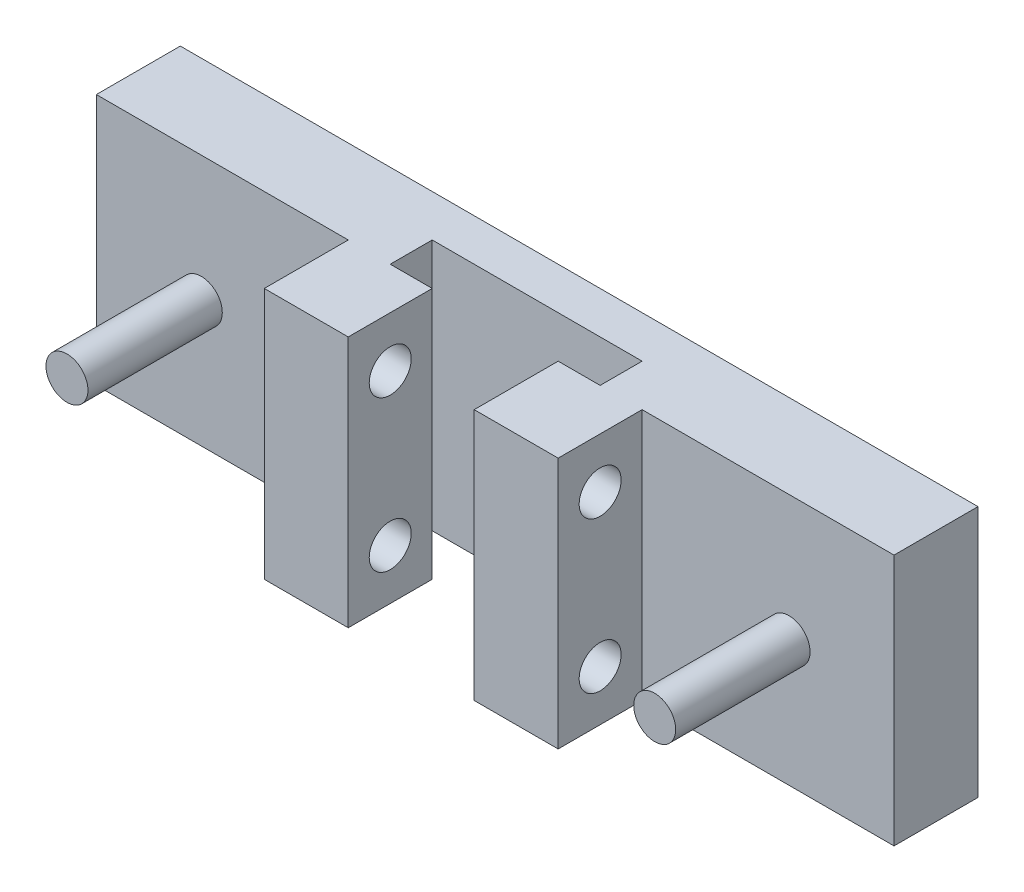
ISO-10303-21;
HEADER;
FILE_DESCRIPTION(('STEP AP214'),'2;1');
FILE_NAME('part.step','',(''),(''),'','','');
FILE_SCHEMA(('AUTOMOTIVE_DESIGN { 1 0 10303 214 1 1 1 1 }'));
ENDSEC;
DATA;
#1=APPLICATION_CONTEXT('core data for automotive mechanical design processes');
#2=APPLICATION_PROTOCOL_DEFINITION('international standard','automotive_design',2000,#1);
#3=PRODUCT_CONTEXT('',#1,'mechanical');
#4=PRODUCT('Part','Part','',(#3));
#5=PRODUCT_RELATED_PRODUCT_CATEGORY('part','',(#4));
#6=PRODUCT_DEFINITION_FORMATION('','',#4);
#7=PRODUCT_DEFINITION_CONTEXT('part definition',#1,'design');
#8=PRODUCT_DEFINITION('design','',#6,#7);
#9=PRODUCT_DEFINITION_SHAPE('','',#8);
#10=(LENGTH_UNIT() NAMED_UNIT(*) SI_UNIT(.MILLI.,.METRE.));
#11=(NAMED_UNIT(*) PLANE_ANGLE_UNIT() SI_UNIT($,.RADIAN.));
#12=(NAMED_UNIT(*) SI_UNIT($,.STERADIAN.) SOLID_ANGLE_UNIT());
#13=UNCERTAINTY_MEASURE_WITH_UNIT(LENGTH_MEASURE(1.E-05),#10,'distance_accuracy_value','');
#14=(GEOMETRIC_REPRESENTATION_CONTEXT(3) GLOBAL_UNCERTAINTY_ASSIGNED_CONTEXT((#13)) GLOBAL_UNIT_ASSIGNED_CONTEXT((#10,
#11,#12)) REPRESENTATION_CONTEXT('',''));
#15=CARTESIAN_POINT('',(0.,0.,0.));
#16=DIRECTION('',(0.,0.,1.));
#17=DIRECTION('',(1.,0.,0.));
#18=AXIS2_PLACEMENT_3D('',#15,#16,#17);
#19=CARTESIAN_POINT('',(0.,30.,-20.));
#20=DIRECTION('',(0.,0.,1.));
#21=DIRECTION('',(1.,0.,0.));
#22=AXIS2_PLACEMENT_3D('',#19,#20,#21);
#23=PLANE('',#22);
#24=DIRECTION('',(-1.,0.,0.));
#25=VECTOR('',#24,1.);
#26=CARTESIAN_POINT('',(0.,0.,-20.));
#27=LINE('',#26,#25);
#28=CARTESIAN_POINT('',(65.,0.,-20.));
#29=VERTEX_POINT('',#28);
#30=CARTESIAN_POINT('',(-30.,0.,-20.));
#31=VERTEX_POINT('',#30);
#32=EDGE_CURVE('E189',#29,#31,#27,.T.);
#33=ORIENTED_EDGE('',*,*,#32,.T.);
#34=DIRECTION('',(0.,-1.,0.));
#35=VECTOR('',#34,1.);
#36=CARTESIAN_POINT('',(-30.,30.,-20.));
#37=LINE('',#36,#35);
#38=CARTESIAN_POINT('',(-30.,30.,-20.));
#39=VERTEX_POINT('',#38);
#40=EDGE_CURVE('E49',#39,#31,#37,.T.);
#41=ORIENTED_EDGE('',*,*,#40,.F.);
#42=DIRECTION('',(-1.,0.,0.));
#43=VECTOR('',#42,1.);
#44=CARTESIAN_POINT('',(0.,30.,-20.));
#45=LINE('',#44,#43);
#46=CARTESIAN_POINT('',(65.,30.,-20.));
#47=VERTEX_POINT('',#46);
#48=EDGE_CURVE('E230',#47,#39,#45,.T.);
#49=ORIENTED_EDGE('',*,*,#48,.F.);
#50=DIRECTION('',(0.,-1.,0.));
#51=VECTOR('',#50,1.);
#52=CARTESIAN_POINT('',(65.,30.,-20.));
#53=LINE('',#52,#51);
#54=EDGE_CURVE('E57',#47,#29,#53,.T.);
#55=ORIENTED_EDGE('',*,*,#54,.T.);
#56=EDGE_LOOP('',(#33,#41,#49,#55));
#57=FACE_BOUND('',#56,.T.);
#58=ADVANCED_FACE('F41',(#57),#23,.F.);
#59=CARTESIAN_POINT('',(-30.,30.,0.));
#60=DIRECTION('',(1.,0.,0.));
#61=DIRECTION('',(0.,0.,-1.));
#62=AXIS2_PLACEMENT_3D('',#59,#60,#61);
#63=PLANE('',#62);
#64=DIRECTION('',(0.,0.,1.));
#65=VECTOR('',#64,1.);
#66=CARTESIAN_POINT('',(-30.,0.,0.));
#67=LINE('',#66,#65);
#68=CARTESIAN_POINT('',(-30.,0.,-10.));
#69=VERTEX_POINT('',#68);
#70=EDGE_CURVE('E191',#31,#69,#67,.T.);
#71=ORIENTED_EDGE('',*,*,#70,.T.);
#72=DIRECTION('',(0.,-1.,0.));
#73=VECTOR('',#72,1.);
#74=CARTESIAN_POINT('',(-30.,30.,-10.));
#75=LINE('',#74,#73);
#76=CARTESIAN_POINT('',(-30.,30.,-10.));
#77=VERTEX_POINT('',#76);
#78=EDGE_CURVE('E258',#77,#69,#75,.T.);
#79=ORIENTED_EDGE('',*,*,#78,.F.);
#80=DIRECTION('',(0.,0.,1.));
#81=VECTOR('',#80,1.);
#82=CARTESIAN_POINT('',(-30.,30.,0.));
#83=LINE('',#82,#81);
#84=EDGE_CURVE('E121',#39,#77,#83,.T.);
#85=ORIENTED_EDGE('',*,*,#84,.F.);
#86=ORIENTED_EDGE('',*,*,#40,.T.);
#87=EDGE_LOOP('',(#71,#79,#85,#86));
#88=FACE_BOUND('',#87,.T.);
#89=ADVANCED_FACE('F334',(#88),#63,.F.);
#90=CARTESIAN_POINT('',(0.,30.,-10.));
#91=DIRECTION('',(0.,0.,1.));
#92=DIRECTION('',(1.,0.,0.));
#93=AXIS2_PLACEMENT_3D('',#90,#91,#92);
#94=PLANE('',#93);
#95=CARTESIAN_POINT('',(-17.5,15.,-10.));
#96=DIRECTION('',(0.,0.,1.));
#97=DIRECTION('',(1.,0.,0.));
#98=AXIS2_PLACEMENT_3D('',#95,#96,#97);
#99=CIRCLE('',#98,2.5);
#100=CARTESIAN_POINT('',(-15.,15.,-10.));
#101=VERTEX_POINT('',#100);
#102=EDGE_CURVE('E410',#101,#101,#99,.T.);
#103=ORIENTED_EDGE('',*,*,#102,.F.);
#104=EDGE_LOOP('',(#103));
#105=FACE_BOUND('',#104,.T.);
#106=DIRECTION('',(-1.,0.,0.));
#107=VECTOR('',#106,1.);
#108=CARTESIAN_POINT('',(0.,0.,-10.));
#109=LINE('',#108,#107);
#110=CARTESIAN_POINT('',(0.,0.,-10.));
#111=VERTEX_POINT('',#110);
#112=EDGE_CURVE('E195',#111,#69,#109,.T.);
#113=ORIENTED_EDGE('',*,*,#112,.F.);
#114=DIRECTION('',(0.,-1.,0.));
#115=VECTOR('',#114,1.);
#116=CARTESIAN_POINT('',(0.,30.,-10.));
#117=LINE('',#116,#115);
#118=CARTESIAN_POINT('',(0.,30.,-10.));
#119=VERTEX_POINT('',#118);
#120=EDGE_CURVE('E256',#119,#111,#117,.T.);
#121=ORIENTED_EDGE('',*,*,#120,.F.);
#122=DIRECTION('',(-1.,0.,0.));
#123=VECTOR('',#122,1.);
#124=CARTESIAN_POINT('',(0.,30.,-10.));
#125=LINE('',#124,#123);
#126=EDGE_CURVE('E289',#119,#77,#125,.T.);
#127=ORIENTED_EDGE('',*,*,#126,.T.);
#128=ORIENTED_EDGE('',*,*,#78,.T.);
#129=EDGE_LOOP('',(#113,#121,#127,#128));
#130=FACE_BOUND('',#129,.T.);
#131=ADVANCED_FACE('F338',(#105,#130),#94,.T.);
#132=CARTESIAN_POINT('',(0.,30.,0.));
#133=DIRECTION('',(-1.,0.,0.));
#134=DIRECTION('',(0.,0.,1.));
#135=AXIS2_PLACEMENT_3D('',#132,#133,#134);
#136=PLANE('',#135);
#137=CARTESIAN_POINT('',(0.,24.,-4.99999999999999));
#138=DIRECTION('',(-1.,0.,0.));
#139=DIRECTION('',(0.,0.,1.));
#140=AXIS2_PLACEMENT_3D('',#137,#138,#139);
#141=CIRCLE('',#140,2.5);
#142=CARTESIAN_POINT('',(0.,24.,-2.49999999999999));
#143=VERTEX_POINT('',#142);
#144=EDGE_CURVE('E192',#143,#143,#141,.F.);
#145=ORIENTED_EDGE('',*,*,#144,.T.);
#146=EDGE_LOOP('',(#145));
#147=FACE_BOUND('',#146,.T.);
#148=CARTESIAN_POINT('',(0.,6.,-4.99999999999999));
#149=DIRECTION('',(-1.,0.,0.));
#150=DIRECTION('',(0.,0.,1.));
#151=AXIS2_PLACEMENT_3D('',#148,#149,#150);
#152=CIRCLE('',#151,2.5);
#153=CARTESIAN_POINT('',(0.,6.,-2.49999999999999));
#154=VERTEX_POINT('',#153);
#155=EDGE_CURVE('E268',#154,#154,#152,.F.);
#156=ORIENTED_EDGE('',*,*,#155,.T.);
#157=EDGE_LOOP('',(#156));
#158=FACE_BOUND('',#157,.T.);
#159=DIRECTION('',(0.,0.,-1.));
#160=VECTOR('',#159,1.);
#161=CARTESIAN_POINT('',(0.,0.,0.));
#162=LINE('',#161,#160);
#163=CARTESIAN_POINT('',(0.,0.,0.));
#164=VERTEX_POINT('',#163);
#165=EDGE_CURVE('E198',#164,#111,#162,.T.);
#166=ORIENTED_EDGE('',*,*,#165,.F.);
#167=DIRECTION('',(0.,-1.,0.));
#168=VECTOR('',#167,1.);
#169=CARTESIAN_POINT('',(0.,30.,0.));
#170=LINE('',#169,#168);
#171=CARTESIAN_POINT('',(0.,30.,0.));
#172=VERTEX_POINT('',#171);
#173=EDGE_CURVE('E254',#172,#164,#170,.T.);
#174=ORIENTED_EDGE('',*,*,#173,.F.);
#175=DIRECTION('',(0.,0.,-1.));
#176=VECTOR('',#175,1.);
#177=CARTESIAN_POINT('',(0.,30.,0.));
#178=LINE('',#177,#176);
#179=EDGE_CURVE('E292',#172,#119,#178,.T.);
#180=ORIENTED_EDGE('',*,*,#179,.T.);
#181=ORIENTED_EDGE('',*,*,#120,.T.);
#182=EDGE_LOOP('',(#166,#174,#180,#181));
#183=FACE_BOUND('',#182,.T.);
#184=ADVANCED_FACE('F347',(#147,#158,#183),#136,.T.);
#185=CARTESIAN_POINT('',(0.,30.,0.));
#186=DIRECTION('',(0.,0.,1.));
#187=DIRECTION('',(1.,0.,0.));
#188=AXIS2_PLACEMENT_3D('',#185,#186,#187);
#189=PLANE('',#188);
#190=DIRECTION('',(-1.,0.,0.));
#191=VECTOR('',#190,1.);
#192=CARTESIAN_POINT('',(0.,0.,0.));
#193=LINE('',#192,#191);
#194=CARTESIAN_POINT('',(10.,0.,0.));
#195=VERTEX_POINT('',#194);
#196=EDGE_CURVE('E201',#195,#164,#193,.T.);
#197=ORIENTED_EDGE('',*,*,#196,.F.);
#198=DIRECTION('',(0.,-1.,0.));
#199=VECTOR('',#198,1.);
#200=CARTESIAN_POINT('',(10.,30.,0.));
#201=LINE('',#200,#199);
#202=CARTESIAN_POINT('',(10.,30.,0.));
#203=VERTEX_POINT('',#202);
#204=EDGE_CURVE('E252',#203,#195,#201,.T.);
#205=ORIENTED_EDGE('',*,*,#204,.F.);
#206=DIRECTION('',(-1.,0.,0.));
#207=VECTOR('',#206,1.);
#208=CARTESIAN_POINT('',(0.,30.,0.));
#209=LINE('',#208,#207);
#210=EDGE_CURVE('E295',#203,#172,#209,.T.);
#211=ORIENTED_EDGE('',*,*,#210,.T.);
#212=ORIENTED_EDGE('',*,*,#173,.T.);
#213=EDGE_LOOP('',(#197,#205,#211,#212));
#214=FACE_BOUND('',#213,.T.);
#215=ADVANCED_FACE('F350',(#214),#189,.T.);
#216=CARTESIAN_POINT('',(10.,30.,0.));
#217=DIRECTION('',(1.,0.,0.));
#218=DIRECTION('',(0.,0.,-1.));
#219=AXIS2_PLACEMENT_3D('',#216,#217,#218);
#220=PLANE('',#219);
#221=CARTESIAN_POINT('',(10.,24.,-5.));
#222=DIRECTION('',(1.,0.,0.));
#223=DIRECTION('',(0.,0.,-1.));
#224=AXIS2_PLACEMENT_3D('',#221,#222,#223);
#225=CIRCLE('',#224,2.5);
#226=CARTESIAN_POINT('',(10.,24.,-7.5));
#227=VERTEX_POINT('',#226);
#228=EDGE_CURVE('E272',#227,#227,#225,.F.);
#229=ORIENTED_EDGE('',*,*,#228,.T.);
#230=EDGE_LOOP('',(#229));
#231=FACE_BOUND('',#230,.T.);
#232=CARTESIAN_POINT('',(10.,6.,-5.));
#233=DIRECTION('',(1.,0.,0.));
#234=DIRECTION('',(0.,0.,-1.));
#235=AXIS2_PLACEMENT_3D('',#232,#233,#234);
#236=CIRCLE('',#235,2.5);
#237=CARTESIAN_POINT('',(10.,6.,-7.5));
#238=VERTEX_POINT('',#237);
#239=EDGE_CURVE('E275',#238,#238,#236,.F.);
#240=ORIENTED_EDGE('',*,*,#239,.T.);
#241=EDGE_LOOP('',(#240));
#242=FACE_BOUND('',#241,.T.);
#243=DIRECTION('',(0.,0.,1.));
#244=VECTOR('',#243,1.);
#245=CARTESIAN_POINT('',(10.,0.,0.));
#246=LINE('',#245,#244);
#247=CARTESIAN_POINT('',(10.,0.,-10.));
#248=VERTEX_POINT('',#247);
#249=EDGE_CURVE('E204',#248,#195,#246,.T.);
#250=ORIENTED_EDGE('',*,*,#249,.F.);
#251=DIRECTION('',(0.,-1.,0.));
#252=VECTOR('',#251,1.);
#253=CARTESIAN_POINT('',(10.,30.,-10.));
#254=LINE('',#253,#252);
#255=CARTESIAN_POINT('',(10.,30.,-10.));
#256=VERTEX_POINT('',#255);
#257=EDGE_CURVE('E250',#256,#248,#254,.T.);
#258=ORIENTED_EDGE('',*,*,#257,.F.);
#259=DIRECTION('',(0.,0.,1.));
#260=VECTOR('',#259,1.);
#261=CARTESIAN_POINT('',(10.,30.,0.));
#262=LINE('',#261,#260);
#263=EDGE_CURVE('E298',#256,#203,#262,.T.);
#264=ORIENTED_EDGE('',*,*,#263,.T.);
#265=ORIENTED_EDGE('',*,*,#204,.T.);
#266=EDGE_LOOP('',(#250,#258,#264,#265));
#267=FACE_BOUND('',#266,.T.);
#268=ADVANCED_FACE('F354',(#231,#242,#267),#220,.T.);
#269=CARTESIAN_POINT('',(0.,30.,-10.));
#270=DIRECTION('',(0.,0.,1.));
#271=DIRECTION('',(1.,0.,0.));
#272=AXIS2_PLACEMENT_3D('',#269,#270,#271);
#273=PLANE('',#272);
#274=DIRECTION('',(-1.,0.,0.));
#275=VECTOR('',#274,1.);
#276=CARTESIAN_POINT('',(0.,0.,-10.));
#277=LINE('',#276,#275);
#278=CARTESIAN_POINT('',(5.,0.,-10.));
#279=VERTEX_POINT('',#278);
#280=EDGE_CURVE('E207',#248,#279,#277,.T.);
#281=ORIENTED_EDGE('',*,*,#280,.T.);
#282=DIRECTION('',(0.,-1.,0.));
#283=VECTOR('',#282,1.);
#284=CARTESIAN_POINT('',(5.,30.,-10.));
#285=LINE('',#284,#283);
#286=CARTESIAN_POINT('',(5.,30.,-10.));
#287=VERTEX_POINT('',#286);
#288=EDGE_CURVE('E247',#287,#279,#285,.T.);
#289=ORIENTED_EDGE('',*,*,#288,.F.);
#290=DIRECTION('',(-1.,0.,0.));
#291=VECTOR('',#290,1.);
#292=CARTESIAN_POINT('',(0.,30.,-10.));
#293=LINE('',#292,#291);
#294=EDGE_CURVE('E301',#256,#287,#293,.T.);
#295=ORIENTED_EDGE('',*,*,#294,.F.);
#296=ORIENTED_EDGE('',*,*,#257,.T.);
#297=EDGE_LOOP('',(#281,#289,#295,#296));
#298=FACE_BOUND('',#297,.T.);
#299=ADVANCED_FACE('F359',(#298),#273,.F.);
#300=CARTESIAN_POINT('',(5.,30.,0.));
#301=DIRECTION('',(-1.,0.,0.));
#302=DIRECTION('',(0.,0.,1.));
#303=AXIS2_PLACEMENT_3D('',#300,#301,#302);
#304=PLANE('',#303);
#305=DIRECTION('',(0.,0.,-1.));
#306=VECTOR('',#305,1.);
#307=CARTESIAN_POINT('',(5.,0.,0.));
#308=LINE('',#307,#306);
#309=CARTESIAN_POINT('',(5.,0.,-15.));
#310=VERTEX_POINT('',#309);
#311=EDGE_CURVE('E209',#279,#310,#308,.T.);
#312=ORIENTED_EDGE('',*,*,#311,.T.);
#313=DIRECTION('',(0.,-1.,0.));
#314=VECTOR('',#313,1.);
#315=CARTESIAN_POINT('',(5.,30.,-15.));
#316=LINE('',#315,#314);
#317=CARTESIAN_POINT('',(5.,30.,-15.));
#318=VERTEX_POINT('',#317);
#319=EDGE_CURVE('E244',#318,#310,#316,.T.);
#320=ORIENTED_EDGE('',*,*,#319,.F.);
#321=DIRECTION('',(0.,0.,-1.));
#322=VECTOR('',#321,1.);
#323=CARTESIAN_POINT('',(5.,30.,0.));
#324=LINE('',#323,#322);
#325=EDGE_CURVE('E303',#287,#318,#324,.T.);
#326=ORIENTED_EDGE('',*,*,#325,.F.);
#327=ORIENTED_EDGE('',*,*,#288,.T.);
#328=EDGE_LOOP('',(#312,#320,#326,#327));
#329=FACE_BOUND('',#328,.T.);
#330=ADVANCED_FACE('F365',(#329),#304,.F.);
#331=CARTESIAN_POINT('',(0.,30.,-15.));
#332=DIRECTION('',(0.,0.,-1.));
#333=DIRECTION('',(-1.,0.,0.));
#334=AXIS2_PLACEMENT_3D('',#331,#332,#333);
#335=PLANE('',#334);
#336=DIRECTION('',(1.,0.,0.));
#337=VECTOR('',#336,1.);
#338=CARTESIAN_POINT('',(0.,0.,-15.));
#339=LINE('',#338,#337);
#340=CARTESIAN_POINT('',(30.,0.,-15.));
#341=VERTEX_POINT('',#340);
#342=EDGE_CURVE('E211',#310,#341,#339,.T.);
#343=ORIENTED_EDGE('',*,*,#342,.T.);
#344=DIRECTION('',(0.,-1.,0.));
#345=VECTOR('',#344,1.);
#346=CARTESIAN_POINT('',(30.,30.,-15.));
#347=LINE('',#346,#345);
#348=CARTESIAN_POINT('',(30.,30.,-15.));
#349=VERTEX_POINT('',#348);
#350=EDGE_CURVE('E241',#349,#341,#347,.T.);
#351=ORIENTED_EDGE('',*,*,#350,.F.);
#352=DIRECTION('',(1.,0.,0.));
#353=VECTOR('',#352,1.);
#354=CARTESIAN_POINT('',(0.,30.,-15.));
#355=LINE('',#354,#353);
#356=EDGE_CURVE('E305',#318,#349,#355,.T.);
#357=ORIENTED_EDGE('',*,*,#356,.F.);
#358=ORIENTED_EDGE('',*,*,#319,.T.);
#359=EDGE_LOOP('',(#343,#351,#357,#358));
#360=FACE_BOUND('',#359,.T.);
#361=ADVANCED_FACE('F369',(#360),#335,.F.);
#362=CARTESIAN_POINT('',(30.,30.,0.));
#363=DIRECTION('',(1.,0.,0.));
#364=DIRECTION('',(0.,0.,-1.));
#365=AXIS2_PLACEMENT_3D('',#362,#363,#364);
#366=PLANE('',#365);
#367=DIRECTION('',(0.,0.,1.));
#368=VECTOR('',#367,1.);
#369=CARTESIAN_POINT('',(30.,0.,0.));
#370=LINE('',#369,#368);
#371=CARTESIAN_POINT('',(30.,0.,-10.));
#372=VERTEX_POINT('',#371);
#373=EDGE_CURVE('E213',#341,#372,#370,.T.);
#374=ORIENTED_EDGE('',*,*,#373,.T.);
#375=DIRECTION('',(0.,-1.,0.));
#376=VECTOR('',#375,1.);
#377=CARTESIAN_POINT('',(30.,30.,-10.));
#378=LINE('',#377,#376);
#379=CARTESIAN_POINT('',(30.,30.,-10.));
#380=VERTEX_POINT('',#379);
#381=EDGE_CURVE('E238',#380,#372,#378,.T.);
#382=ORIENTED_EDGE('',*,*,#381,.F.);
#383=DIRECTION('',(0.,0.,1.));
#384=VECTOR('',#383,1.);
#385=CARTESIAN_POINT('',(30.,30.,0.));
#386=LINE('',#385,#384);
#387=EDGE_CURVE('E307',#349,#380,#386,.T.);
#388=ORIENTED_EDGE('',*,*,#387,.F.);
#389=ORIENTED_EDGE('',*,*,#350,.T.);
#390=EDGE_LOOP('',(#374,#382,#388,#389));
#391=FACE_BOUND('',#390,.T.);
#392=ADVANCED_FACE('F374',(#391),#366,.F.);
#393=CARTESIAN_POINT('',(0.,30.,-10.));
#394=DIRECTION('',(0.,0.,1.));
#395=DIRECTION('',(1.,0.,0.));
#396=AXIS2_PLACEMENT_3D('',#393,#394,#395);
#397=PLANE('',#396);
#398=DIRECTION('',(-1.,0.,0.));
#399=VECTOR('',#398,1.);
#400=CARTESIAN_POINT('',(0.,0.,-10.));
#401=LINE('',#400,#399);
#402=CARTESIAN_POINT('',(25.,0.,-10.));
#403=VERTEX_POINT('',#402);
#404=EDGE_CURVE('E215',#372,#403,#401,.T.);
#405=ORIENTED_EDGE('',*,*,#404,.T.);
#406=DIRECTION('',(0.,-1.,0.));
#407=VECTOR('',#406,1.);
#408=CARTESIAN_POINT('',(25.,30.,-10.));
#409=LINE('',#408,#407);
#410=CARTESIAN_POINT('',(25.,30.,-10.));
#411=VERTEX_POINT('',#410);
#412=EDGE_CURVE('E236',#411,#403,#409,.T.);
#413=ORIENTED_EDGE('',*,*,#412,.F.);
#414=DIRECTION('',(-1.,0.,0.));
#415=VECTOR('',#414,1.);
#416=CARTESIAN_POINT('',(0.,30.,-10.));
#417=LINE('',#416,#415);
#418=EDGE_CURVE('E309',#380,#411,#417,.T.);
#419=ORIENTED_EDGE('',*,*,#418,.F.);
#420=ORIENTED_EDGE('',*,*,#381,.T.);
#421=EDGE_LOOP('',(#405,#413,#419,#420));
#422=FACE_BOUND('',#421,.T.);
#423=ADVANCED_FACE('F377',(#422),#397,.F.);
#424=CARTESIAN_POINT('',(25.,30.,0.));
#425=DIRECTION('',(-1.,0.,0.));
#426=DIRECTION('',(0.,0.,1.));
#427=AXIS2_PLACEMENT_3D('',#424,#425,#426);
#428=PLANE('',#427);
#429=CARTESIAN_POINT('',(25.,24.,-5.));
#430=DIRECTION('',(-1.,0.,0.));
#431=DIRECTION('',(0.,0.,1.));
#432=AXIS2_PLACEMENT_3D('',#429,#430,#431);
#433=CIRCLE('',#432,2.5);
#434=CARTESIAN_POINT('',(25.,24.,-2.5));
#435=VERTEX_POINT('',#434);
#436=EDGE_CURVE('E267',#435,#435,#433,.F.);
#437=ORIENTED_EDGE('',*,*,#436,.T.);
#438=EDGE_LOOP('',(#437));
#439=FACE_BOUND('',#438,.T.);
#440=CARTESIAN_POINT('',(25.,6.,-5.));
#441=DIRECTION('',(-1.,0.,0.));
#442=DIRECTION('',(0.,0.,1.));
#443=AXIS2_PLACEMENT_3D('',#440,#441,#442);
#444=CIRCLE('',#443,2.5);
#445=CARTESIAN_POINT('',(25.,6.,-2.5));
#446=VERTEX_POINT('',#445);
#447=EDGE_CURVE('E263',#446,#446,#444,.F.);
#448=ORIENTED_EDGE('',*,*,#447,.T.);
#449=EDGE_LOOP('',(#448));
#450=FACE_BOUND('',#449,.T.);
#451=DIRECTION('',(0.,0.,-1.));
#452=VECTOR('',#451,1.);
#453=CARTESIAN_POINT('',(25.,0.,0.));
#454=LINE('',#453,#452);
#455=CARTESIAN_POINT('',(25.,0.,0.));
#456=VERTEX_POINT('',#455);
#457=EDGE_CURVE('E218',#456,#403,#454,.T.);
#458=ORIENTED_EDGE('',*,*,#457,.F.);
#459=DIRECTION('',(0.,-1.,0.));
#460=VECTOR('',#459,1.);
#461=CARTESIAN_POINT('',(25.,30.,0.));
#462=LINE('',#461,#460);
#463=CARTESIAN_POINT('',(25.,30.,0.));
#464=VERTEX_POINT('',#463);
#465=EDGE_CURVE('E234',#464,#456,#462,.T.);
#466=ORIENTED_EDGE('',*,*,#465,.F.);
#467=DIRECTION('',(0.,0.,-1.));
#468=VECTOR('',#467,1.);
#469=CARTESIAN_POINT('',(25.,30.,0.));
#470=LINE('',#469,#468);
#471=EDGE_CURVE('E184',#464,#411,#470,.T.);
#472=ORIENTED_EDGE('',*,*,#471,.T.);
#473=ORIENTED_EDGE('',*,*,#412,.T.);
#474=EDGE_LOOP('',(#458,#466,#472,#473));
#475=FACE_BOUND('',#474,.T.);
#476=ADVANCED_FACE('F313',(#439,#450,#475),#428,.T.);
#477=CARTESIAN_POINT('',(0.,30.,0.));
#478=DIRECTION('',(0.,0.,1.));
#479=DIRECTION('',(1.,0.,0.));
#480=AXIS2_PLACEMENT_3D('',#477,#478,#479);
#481=PLANE('',#480);
#482=DIRECTION('',(-1.,0.,0.));
#483=VECTOR('',#482,1.);
#484=CARTESIAN_POINT('',(0.,0.,0.));
#485=LINE('',#484,#483);
#486=CARTESIAN_POINT('',(35.,0.,0.));
#487=VERTEX_POINT('',#486);
#488=EDGE_CURVE('E221',#487,#456,#485,.T.);
#489=ORIENTED_EDGE('',*,*,#488,.F.);
#490=DIRECTION('',(0.,-1.,0.));
#491=VECTOR('',#490,1.);
#492=CARTESIAN_POINT('',(35.,30.,0.));
#493=LINE('',#492,#491);
#494=CARTESIAN_POINT('',(35.,30.,0.));
#495=VERTEX_POINT('',#494);
#496=EDGE_CURVE('E170',#495,#487,#493,.T.);
#497=ORIENTED_EDGE('',*,*,#496,.F.);
#498=DIRECTION('',(-1.,0.,0.));
#499=VECTOR('',#498,1.);
#500=CARTESIAN_POINT('',(0.,30.,0.));
#501=LINE('',#500,#499);
#502=EDGE_CURVE('E182',#495,#464,#501,.T.);
#503=ORIENTED_EDGE('',*,*,#502,.T.);
#504=ORIENTED_EDGE('',*,*,#465,.T.);
#505=EDGE_LOOP('',(#489,#497,#503,#504));
#506=FACE_BOUND('',#505,.T.);
#507=ADVANCED_FACE('F318',(#506),#481,.T.);
#508=CARTESIAN_POINT('',(35.,30.,0.));
#509=DIRECTION('',(1.,0.,0.));
#510=DIRECTION('',(0.,0.,-1.));
#511=AXIS2_PLACEMENT_3D('',#508,#509,#510);
#512=PLANE('',#511);
#513=CARTESIAN_POINT('',(35.,24.,-5.00000000000001));
#514=DIRECTION('',(1.,0.,0.));
#515=DIRECTION('',(0.,0.,-1.));
#516=AXIS2_PLACEMENT_3D('',#513,#514,#515);
#517=CIRCLE('',#516,2.5);
#518=CARTESIAN_POINT('',(35.,24.,-7.50000000000001));
#519=VERTEX_POINT('',#518);
#520=EDGE_CURVE('E265',#519,#519,#517,.F.);
#521=ORIENTED_EDGE('',*,*,#520,.T.);
#522=EDGE_LOOP('',(#521));
#523=FACE_BOUND('',#522,.T.);
#524=CARTESIAN_POINT('',(35.,6.,-5.00000000000001));
#525=DIRECTION('',(1.,0.,0.));
#526=DIRECTION('',(0.,0.,-1.));
#527=AXIS2_PLACEMENT_3D('',#524,#525,#526);
#528=CIRCLE('',#527,2.5);
#529=CARTESIAN_POINT('',(35.,6.,-7.50000000000001));
#530=VERTEX_POINT('',#529);
#531=EDGE_CURVE('E261',#530,#530,#528,.F.);
#532=ORIENTED_EDGE('',*,*,#531,.T.);
#533=EDGE_LOOP('',(#532));
#534=FACE_BOUND('',#533,.T.);
#535=DIRECTION('',(0.,0.,1.));
#536=VECTOR('',#535,1.);
#537=CARTESIAN_POINT('',(35.,0.,0.));
#538=LINE('',#537,#536);
#539=CARTESIAN_POINT('',(35.,0.,-10.));
#540=VERTEX_POINT('',#539);
#541=EDGE_CURVE('E167',#540,#487,#538,.T.);
#542=ORIENTED_EDGE('',*,*,#541,.F.);
#543=DIRECTION('',(0.,-1.,0.));
#544=VECTOR('',#543,1.);
#545=CARTESIAN_POINT('',(35.,30.,-10.));
#546=LINE('',#545,#544);
#547=CARTESIAN_POINT('',(35.,30.,-10.));
#548=VERTEX_POINT('',#547);
#549=EDGE_CURVE('E161',#548,#540,#546,.T.);
#550=ORIENTED_EDGE('',*,*,#549,.F.);
#551=DIRECTION('',(0.,0.,1.));
#552=VECTOR('',#551,1.);
#553=CARTESIAN_POINT('',(35.,30.,0.));
#554=LINE('',#553,#552);
#555=EDGE_CURVE('E165',#548,#495,#554,.T.);
#556=ORIENTED_EDGE('',*,*,#555,.T.);
#557=ORIENTED_EDGE('',*,*,#496,.T.);
#558=EDGE_LOOP('',(#542,#550,#556,#557));
#559=FACE_BOUND('',#558,.T.);
#560=ADVANCED_FACE('F163',(#523,#534,#559),#512,.T.);
#561=CARTESIAN_POINT('',(0.,30.,-10.));
#562=DIRECTION('',(0.,0.,-1.));
#563=DIRECTION('',(-1.,0.,0.));
#564=AXIS2_PLACEMENT_3D('',#561,#562,#563);
#565=PLANE('',#564);
#566=CARTESIAN_POINT('',(52.5,15.,-10.));
#567=DIRECTION('',(0.,0.,-1.));
#568=DIRECTION('',(-1.,0.,0.));
#569=AXIS2_PLACEMENT_3D('',#566,#567,#568);
#570=CIRCLE('',#569,2.5);
#571=CARTESIAN_POINT('',(50.,15.,-10.));
#572=VERTEX_POINT('',#571);
#573=EDGE_CURVE('E11',#572,#572,#570,.F.);
#574=ORIENTED_EDGE('',*,*,#573,.F.);
#575=EDGE_LOOP('',(#574));
#576=FACE_BOUND('',#575,.T.);
#577=DIRECTION('',(1.,0.,0.));
#578=VECTOR('',#577,1.);
#579=CARTESIAN_POINT('',(0.,0.,-10.));
#580=LINE('',#579,#578);
#581=CARTESIAN_POINT('',(65.,0.,-10.));
#582=VERTEX_POINT('',#581);
#583=EDGE_CURVE('E225',#540,#582,#580,.T.);
#584=ORIENTED_EDGE('',*,*,#583,.T.);
#585=DIRECTION('',(0.,-1.,0.));
#586=VECTOR('',#585,1.);
#587=CARTESIAN_POINT('',(65.,30.,-10.));
#588=LINE('',#587,#586);
#589=CARTESIAN_POINT('',(65.,30.,-10.));
#590=VERTEX_POINT('',#589);
#591=EDGE_CURVE('E108',#590,#582,#588,.T.);
#592=ORIENTED_EDGE('',*,*,#591,.F.);
#593=DIRECTION('',(1.,0.,0.));
#594=VECTOR('',#593,1.);
#595=CARTESIAN_POINT('',(0.,30.,-10.));
#596=LINE('',#595,#594);
#597=EDGE_CURVE('E172',#548,#590,#596,.T.);
#598=ORIENTED_EDGE('',*,*,#597,.F.);
#599=ORIENTED_EDGE('',*,*,#549,.T.);
#600=EDGE_LOOP('',(#584,#592,#598,#599));
#601=FACE_BOUND('',#600,.T.);
#602=ADVANCED_FACE('F173',(#576,#601),#565,.F.);
#603=CARTESIAN_POINT('',(65.,30.,0.));
#604=DIRECTION('',(1.,0.,0.));
#605=DIRECTION('',(0.,0.,-1.));
#606=AXIS2_PLACEMENT_3D('',#603,#604,#605);
#607=PLANE('',#606);
#608=DIRECTION('',(0.,0.,1.));
#609=VECTOR('',#608,1.);
#610=CARTESIAN_POINT('',(65.,0.,0.));
#611=LINE('',#610,#609);
#612=EDGE_CURVE('E227',#29,#582,#611,.T.);
#613=ORIENTED_EDGE('',*,*,#612,.F.);
#614=ORIENTED_EDGE('',*,*,#54,.F.);
#615=DIRECTION('',(0.,0.,1.));
#616=VECTOR('',#615,1.);
#617=CARTESIAN_POINT('',(65.,30.,0.));
#618=LINE('',#617,#616);
#619=EDGE_CURVE('E176',#47,#590,#618,.T.);
#620=ORIENTED_EDGE('',*,*,#619,.T.);
#621=ORIENTED_EDGE('',*,*,#591,.T.);
#622=EDGE_LOOP('',(#613,#614,#620,#621));
#623=FACE_BOUND('',#622,.T.);
#624=ADVANCED_FACE('F321',(#623),#607,.T.);
#625=CARTESIAN_POINT('',(0.,30.,0.));
#626=DIRECTION('',(0.,1.,0.));
#627=DIRECTION('',(0.,0.,1.));
#628=AXIS2_PLACEMENT_3D('',#625,#626,#627);
#629=PLANE('',#628);
#630=ORIENTED_EDGE('',*,*,#48,.T.);
#631=ORIENTED_EDGE('',*,*,#84,.T.);
#632=ORIENTED_EDGE('',*,*,#126,.F.);
#633=ORIENTED_EDGE('',*,*,#179,.F.);
#634=ORIENTED_EDGE('',*,*,#210,.F.);
#635=ORIENTED_EDGE('',*,*,#263,.F.);
#636=ORIENTED_EDGE('',*,*,#294,.T.);
#637=ORIENTED_EDGE('',*,*,#325,.T.);
#638=ORIENTED_EDGE('',*,*,#356,.T.);
#639=ORIENTED_EDGE('',*,*,#387,.T.);
#640=ORIENTED_EDGE('',*,*,#418,.T.);
#641=ORIENTED_EDGE('',*,*,#471,.F.);
#642=ORIENTED_EDGE('',*,*,#502,.F.);
#643=ORIENTED_EDGE('',*,*,#555,.F.);
#644=ORIENTED_EDGE('',*,*,#597,.T.);
#645=ORIENTED_EDGE('',*,*,#619,.F.);
#646=EDGE_LOOP('',(#630,#631,#632,#633,#634,#635,#636,#637,#638,#639,#640,#641,#642,#643,#644,#645));
#647=FACE_BOUND('',#646,.T.);
#648=ADVANCED_FACE('F179',(#647),#629,.T.);
#649=CARTESIAN_POINT('',(0.,0.,0.));
#650=DIRECTION('',(0.,1.,0.));
#651=DIRECTION('',(0.,0.,1.));
#652=AXIS2_PLACEMENT_3D('',#649,#650,#651);
#653=PLANE('',#652);
#654=ORIENTED_EDGE('',*,*,#32,.F.);
#655=ORIENTED_EDGE('',*,*,#612,.T.);
#656=ORIENTED_EDGE('',*,*,#583,.F.);
#657=ORIENTED_EDGE('',*,*,#541,.T.);
#658=ORIENTED_EDGE('',*,*,#488,.T.);
#659=ORIENTED_EDGE('',*,*,#457,.T.);
#660=ORIENTED_EDGE('',*,*,#404,.F.);
#661=ORIENTED_EDGE('',*,*,#373,.F.);
#662=ORIENTED_EDGE('',*,*,#342,.F.);
#663=ORIENTED_EDGE('',*,*,#311,.F.);
#664=ORIENTED_EDGE('',*,*,#280,.F.);
#665=ORIENTED_EDGE('',*,*,#249,.T.);
#666=ORIENTED_EDGE('',*,*,#196,.T.);
#667=ORIENTED_EDGE('',*,*,#165,.T.);
#668=ORIENTED_EDGE('',*,*,#112,.T.);
#669=ORIENTED_EDGE('',*,*,#70,.F.);
#670=EDGE_LOOP('',(#654,#655,#656,#657,#658,#659,#660,#661,#662,#663,#664,#665,#666,#667,#668,#669));
#671=FACE_BOUND('',#670,.T.);
#672=ADVANCED_FACE('F320',(#671),#653,.F.);
#673=CARTESIAN_POINT('',(65.,6.,-5.00000000000002));
#674=DIRECTION('',(-1.,0.,0.));
#675=DIRECTION('',(0.,0.,1.));
#676=AXIS2_PLACEMENT_3D('',#673,#674,#675);
#677=CYLINDRICAL_SURFACE('',#676,2.5);
#678=ORIENTED_EDGE('',*,*,#447,.F.);
#679=EDGE_LOOP('',(#678));
#680=FACE_BOUND('',#679,.T.);
#681=ORIENTED_EDGE('',*,*,#531,.F.);
#682=EDGE_LOOP('',(#681));
#683=FACE_BOUND('',#682,.T.);
#684=ADVANCED_FACE('F422',(#680,#683),#677,.F.);
#685=CARTESIAN_POINT('',(65.,24.,-5.00000000000002));
#686=DIRECTION('',(-1.,0.,0.));
#687=DIRECTION('',(0.,0.,1.));
#688=AXIS2_PLACEMENT_3D('',#685,#686,#687);
#689=CYLINDRICAL_SURFACE('',#688,2.5);
#690=ORIENTED_EDGE('',*,*,#436,.F.);
#691=EDGE_LOOP('',(#690));
#692=FACE_BOUND('',#691,.T.);
#693=ORIENTED_EDGE('',*,*,#520,.F.);
#694=EDGE_LOOP('',(#693));
#695=FACE_BOUND('',#694,.T.);
#696=ADVANCED_FACE('F425',(#692,#695),#689,.F.);
#697=ORIENTED_EDGE('',*,*,#155,.F.);
#698=EDGE_LOOP('',(#697));
#699=FACE_BOUND('',#698,.T.);
#700=ORIENTED_EDGE('',*,*,#239,.F.);
#701=EDGE_LOOP('',(#700));
#702=FACE_BOUND('',#701,.T.);
#703=ADVANCED_FACE('F427',(#699,#702),#677,.F.);
#704=ORIENTED_EDGE('',*,*,#144,.F.);
#705=EDGE_LOOP('',(#704));
#706=FACE_BOUND('',#705,.T.);
#707=ORIENTED_EDGE('',*,*,#228,.F.);
#708=EDGE_LOOP('',(#707));
#709=FACE_BOUND('',#708,.T.);
#710=ADVANCED_FACE('F501',(#706,#709),#689,.F.);
#711=CARTESIAN_POINT('',(52.5,15.,6.));
#712=DIRECTION('',(0.,0.,-1.));
#713=DIRECTION('',(-1.,0.,0.));
#714=AXIS2_PLACEMENT_3D('',#711,#712,#713);
#715=CYLINDRICAL_SURFACE('',#714,2.5);
#716=CARTESIAN_POINT('',(52.5,15.,6.));
#717=DIRECTION('',(0.,0.,1.));
#718=DIRECTION('',(1.,0.,0.));
#719=AXIS2_PLACEMENT_3D('',#716,#717,#718);
#720=CIRCLE('',#719,2.5);
#721=CARTESIAN_POINT('',(55.,15.,6.));
#722=VERTEX_POINT('',#721);
#723=EDGE_CURVE('E412',#722,#722,#720,.T.);
#724=ORIENTED_EDGE('',*,*,#723,.F.);
#725=EDGE_LOOP('',(#724));
#726=FACE_BOUND('',#725,.T.);
#727=ORIENTED_EDGE('',*,*,#573,.T.);
#728=EDGE_LOOP('',(#727));
#729=FACE_BOUND('',#728,.T.);
#730=ADVANCED_FACE('F516',(#726,#729),#715,.T.);
#731=CARTESIAN_POINT('',(52.5,15.,6.));
#732=DIRECTION('',(0.,0.,1.));
#733=DIRECTION('',(1.,0.,0.));
#734=AXIS2_PLACEMENT_3D('',#731,#732,#733);
#735=PLANE('',#734);
#736=ORIENTED_EDGE('',*,*,#723,.T.);
#737=EDGE_LOOP('',(#736));
#738=FACE_BOUND('',#737,.T.);
#739=ADVANCED_FACE('F524',(#738),#735,.T.);
#740=CARTESIAN_POINT('',(-17.5,15.,6.));
#741=DIRECTION('',(0.,0.,-1.));
#742=DIRECTION('',(-1.,0.,0.));
#743=AXIS2_PLACEMENT_3D('',#740,#741,#742);
#744=CYLINDRICAL_SURFACE('',#743,2.5);
#745=CARTESIAN_POINT('',(-17.5,15.,6.));
#746=DIRECTION('',(0.,0.,1.));
#747=DIRECTION('',(1.,0.,0.));
#748=AXIS2_PLACEMENT_3D('',#745,#746,#747);
#749=CIRCLE('',#748,2.5);
#750=CARTESIAN_POINT('',(-15.,15.,6.));
#751=VERTEX_POINT('',#750);
#752=EDGE_CURVE('E264',#751,#751,#749,.T.);
#753=ORIENTED_EDGE('',*,*,#752,.F.);
#754=EDGE_LOOP('',(#753));
#755=FACE_BOUND('',#754,.T.);
#756=ORIENTED_EDGE('',*,*,#102,.T.);
#757=EDGE_LOOP('',(#756));
#758=FACE_BOUND('',#757,.T.);
#759=ADVANCED_FACE('F534',(#755,#758),#744,.T.);
#760=CARTESIAN_POINT('',(-17.5,15.,6.));
#761=DIRECTION('',(0.,0.,1.));
#762=DIRECTION('',(1.,0.,0.));
#763=AXIS2_PLACEMENT_3D('',#760,#761,#762);
#764=PLANE('',#763);
#765=ORIENTED_EDGE('',*,*,#752,.T.);
#766=EDGE_LOOP('',(#765));
#767=FACE_BOUND('',#766,.T.);
#768=ADVANCED_FACE('F544',(#767),#764,.T.);
#769=CLOSED_SHELL('',(#58,#89,#131,#184,#215,#268,#299,#330,#361,#392,#423,#476,#507,#560,#602,
#624,#648,#672,#684,#696,#703,#710,#730,#739,#759,#768));
#770=MANIFOLD_SOLID_BREP('B2',#769);
#771=ADVANCED_BREP_SHAPE_REPRESENTATION('',(#18,#770),#14);
#772=SHAPE_DEFINITION_REPRESENTATION(#9,#771);
ENDSEC;
END-ISO-10303-21;
